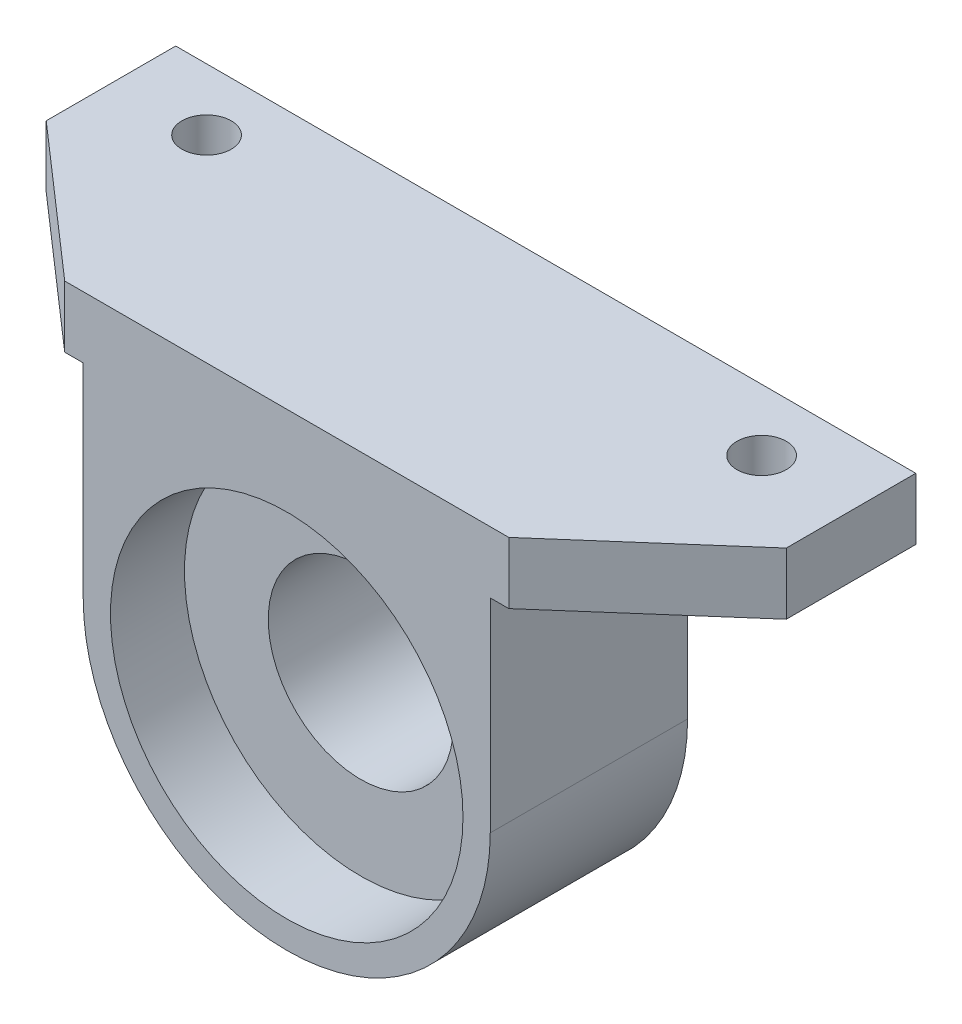
ISO-10303-21;
HEADER;
FILE_DESCRIPTION(('STEP AP214'),'2;1');
FILE_NAME('part.step','',(''),(''),'','','');
FILE_SCHEMA(('AUTOMOTIVE_DESIGN { 1 0 10303 214 1 1 1 1 }'));
ENDSEC;
DATA;
#1=APPLICATION_CONTEXT('core data for automotive mechanical design processes');
#2=APPLICATION_PROTOCOL_DEFINITION('international standard','automotive_design',2000,#1);
#3=PRODUCT_CONTEXT('',#1,'mechanical');
#4=PRODUCT('Part','Part','',(#3));
#5=PRODUCT_RELATED_PRODUCT_CATEGORY('part','',(#4));
#6=PRODUCT_DEFINITION_FORMATION('','',#4);
#7=PRODUCT_DEFINITION_CONTEXT('part definition',#1,'design');
#8=PRODUCT_DEFINITION('design','',#6,#7);
#9=PRODUCT_DEFINITION_SHAPE('','',#8);
#10=(LENGTH_UNIT() NAMED_UNIT(*) SI_UNIT(.MILLI.,.METRE.));
#11=(NAMED_UNIT(*) PLANE_ANGLE_UNIT() SI_UNIT($,.RADIAN.));
#12=(NAMED_UNIT(*) SI_UNIT($,.STERADIAN.) SOLID_ANGLE_UNIT());
#13=UNCERTAINTY_MEASURE_WITH_UNIT(LENGTH_MEASURE(1.E-05),#10,'distance_accuracy_value','');
#14=(GEOMETRIC_REPRESENTATION_CONTEXT(3) GLOBAL_UNCERTAINTY_ASSIGNED_CONTEXT((#13)) GLOBAL_UNIT_ASSIGNED_CONTEXT((#10,
#11,#12)) REPRESENTATION_CONTEXT('',''));
#15=CARTESIAN_POINT('',(0.,0.,0.));
#16=DIRECTION('',(0.,0.,1.));
#17=DIRECTION('',(1.,0.,0.));
#18=AXIS2_PLACEMENT_3D('',#15,#16,#17);
#19=CARTESIAN_POINT('',(0.,0.,6.));
#20=DIRECTION('',(0.,0.,1.));
#21=DIRECTION('',(1.,0.,0.));
#22=AXIS2_PLACEMENT_3D('',#19,#20,#21);
#23=PLANE('',#22);
#24=CARTESIAN_POINT('',(0.,0.,6.));
#25=DIRECTION('',(0.,0.,1.));
#26=DIRECTION('',(1.,0.,0.));
#27=AXIS2_PLACEMENT_3D('',#24,#25,#26);
#28=CIRCLE('',#27,14.29);
#29=CARTESIAN_POINT('',(14.29,0.,6.));
#30=VERTEX_POINT('',#29);
#31=EDGE_CURVE('E72',#30,#30,#28,.T.);
#32=ORIENTED_EDGE('',*,*,#31,.F.);
#33=EDGE_LOOP('',(#32));
#34=FACE_BOUND('',#33,.T.);
#35=DIRECTION('',(1.,0.,0.));
#36=VECTOR('',#35,1.);
#37=CARTESIAN_POINT('',(0.,16.5,6.));
#38=LINE('',#37,#36);
#39=CARTESIAN_POINT('',(16.5,16.5,6.));
#40=VERTEX_POINT('',#39);
#41=CARTESIAN_POINT('',(18.,16.5,6.));
#42=VERTEX_POINT('',#41);
#43=EDGE_CURVE('E153',#40,#42,#38,.T.);
#44=ORIENTED_EDGE('',*,*,#43,.T.);
#45=DIRECTION('',(0.,1.,0.));
#46=VECTOR('',#45,1.);
#47=CARTESIAN_POINT('',(18.,16.5,6.));
#48=LINE('',#47,#46);
#49=CARTESIAN_POINT('',(18.,21.5,6.));
#50=VERTEX_POINT('',#49);
#51=EDGE_CURVE('E138',#42,#50,#48,.T.);
#52=ORIENTED_EDGE('',*,*,#51,.T.);
#53=DIRECTION('',(1.,0.,0.));
#54=VECTOR('',#53,1.);
#55=CARTESIAN_POINT('',(-30.,21.5,6.));
#56=LINE('',#55,#54);
#57=CARTESIAN_POINT('',(-18.,21.5,6.00000000000001));
#58=VERTEX_POINT('',#57);
#59=EDGE_CURVE('E302',#58,#50,#56,.T.);
#60=ORIENTED_EDGE('',*,*,#59,.F.);
#61=DIRECTION('',(0.,1.,0.));
#62=VECTOR('',#61,1.);
#63=CARTESIAN_POINT('',(-18.,16.5,6.00000000000001));
#64=LINE('',#63,#62);
#65=CARTESIAN_POINT('',(-18.,16.5,6.00000000000001));
#66=VERTEX_POINT('',#65);
#67=EDGE_CURVE('E282',#66,#58,#64,.T.);
#68=ORIENTED_EDGE('',*,*,#67,.F.);
#69=CARTESIAN_POINT('',(-16.5,16.5,6.));
#70=VERTEX_POINT('',#69);
#71=EDGE_CURVE('E163',#66,#70,#38,.T.);
#72=ORIENTED_EDGE('',*,*,#71,.T.);
#73=DIRECTION('',(0.,-1.,0.));
#74=VECTOR('',#73,1.);
#75=CARTESIAN_POINT('',(-16.5,0.,6.));
#76=LINE('',#75,#74);
#77=CARTESIAN_POINT('',(-16.5,0.,6.));
#78=VERTEX_POINT('',#77);
#79=EDGE_CURVE('E199',#70,#78,#76,.T.);
#80=ORIENTED_EDGE('',*,*,#79,.T.);
#81=CARTESIAN_POINT('',(0.,0.,6.));
#82=DIRECTION('',(0.,0.,1.));
#83=DIRECTION('',(1.,0.,0.));
#84=AXIS2_PLACEMENT_3D('',#81,#82,#83);
#85=CIRCLE('',#84,16.5);
#86=CARTESIAN_POINT('',(16.5,0.,6.));
#87=VERTEX_POINT('',#86);
#88=EDGE_CURVE('E12',#78,#87,#85,.T.);
#89=ORIENTED_EDGE('',*,*,#88,.T.);
#90=DIRECTION('',(0.,-1.,0.));
#91=VECTOR('',#90,1.);
#92=CARTESIAN_POINT('',(16.5,0.,6.));
#93=LINE('',#92,#91);
#94=EDGE_CURVE('E161',#40,#87,#93,.T.);
#95=ORIENTED_EDGE('',*,*,#94,.F.);
#96=EDGE_LOOP('',(#44,#52,#60,#68,#72,#80,#89,#95));
#97=FACE_BOUND('',#96,.T.);
#98=ADVANCED_FACE('F63',(#34,#97),#23,.T.);
#99=CARTESIAN_POINT('',(0.,16.5,0.));
#100=DIRECTION('',(0.,1.,0.));
#101=DIRECTION('',(0.,0.,1.));
#102=AXIS2_PLACEMENT_3D('',#99,#100,#101);
#103=PLANE('',#102);
#104=CARTESIAN_POINT('',(22.5,16.5,-10.));
#105=DIRECTION('',(0.,1.,0.));
#106=DIRECTION('',(0.,0.,1.));
#107=AXIS2_PLACEMENT_3D('',#104,#105,#106);
#108=CIRCLE('',#107,2.);
#109=CARTESIAN_POINT('',(22.5,16.5,-7.99999999999999));
#110=VERTEX_POINT('',#109);
#111=EDGE_CURVE('E168',#110,#110,#108,.T.);
#112=ORIENTED_EDGE('',*,*,#111,.T.);
#113=EDGE_LOOP('',(#112));
#114=FACE_BOUND('',#113,.T.);
#115=CARTESIAN_POINT('',(-22.5,16.5,-10.));
#116=DIRECTION('',(0.,1.,0.));
#117=DIRECTION('',(0.,0.,1.));
#118=AXIS2_PLACEMENT_3D('',#115,#116,#117);
#119=CIRCLE('',#118,2.);
#120=CARTESIAN_POINT('',(-22.5,16.5,-7.99999999999999));
#121=VERTEX_POINT('',#120);
#122=EDGE_CURVE('E182',#121,#121,#119,.T.);
#123=ORIENTED_EDGE('',*,*,#122,.T.);
#124=EDGE_LOOP('',(#123));
#125=FACE_BOUND('',#124,.T.);
#126=DIRECTION('',(0.752576694706878,0.,-0.658504607868518));
#127=VECTOR('',#126,1.);
#128=CARTESIAN_POINT('',(10.7787610619469,16.5,12.3185840707965));
#129=LINE('',#128,#127);
#130=CARTESIAN_POINT('',(30.,16.5,-4.50000000000001));
#131=VERTEX_POINT('',#130);
#132=EDGE_CURVE('E87',#42,#131,#129,.T.);
#133=ORIENTED_EDGE('',*,*,#132,.F.);
#134=ORIENTED_EDGE('',*,*,#43,.F.);
#135=DIRECTION('',(0.,0.,-1.));
#136=VECTOR('',#135,1.);
#137=CARTESIAN_POINT('',(16.5,16.5,6.));
#138=LINE('',#137,#136);
#139=CARTESIAN_POINT('',(16.5,16.5,-10.));
#140=VERTEX_POINT('',#139);
#141=EDGE_CURVE('E189',#40,#140,#138,.T.);
#142=ORIENTED_EDGE('',*,*,#141,.T.);
#143=DIRECTION('',(-1.,0.,0.));
#144=VECTOR('',#143,1.);
#145=CARTESIAN_POINT('',(30.,16.5,-10.));
#146=LINE('',#145,#144);
#147=CARTESIAN_POINT('',(-16.5,16.5,-10.));
#148=VERTEX_POINT('',#147);
#149=EDGE_CURVE('E273',#140,#148,#146,.T.);
#150=ORIENTED_EDGE('',*,*,#149,.T.);
#151=DIRECTION('',(0.,0.,-1.));
#152=VECTOR('',#151,1.);
#153=CARTESIAN_POINT('',(-16.5,16.5,6.));
#154=LINE('',#153,#152);
#155=EDGE_CURVE('E209',#70,#148,#154,.T.);
#156=ORIENTED_EDGE('',*,*,#155,.F.);
#157=ORIENTED_EDGE('',*,*,#71,.F.);
#158=DIRECTION('',(0.752576694706878,0.,0.658504607868518));
#159=VECTOR('',#158,1.);
#160=CARTESIAN_POINT('',(-10.7787610619469,16.5,12.3185840707965));
#161=LINE('',#160,#159);
#162=CARTESIAN_POINT('',(-30.,16.5,-4.50000000000001));
#163=VERTEX_POINT('',#162);
#164=EDGE_CURVE('E322',#163,#66,#161,.T.);
#165=ORIENTED_EDGE('',*,*,#164,.F.);
#166=DIRECTION('',(0.,0.,-1.));
#167=VECTOR('',#166,1.);
#168=CARTESIAN_POINT('',(-30.,16.5,0.));
#169=LINE('',#168,#167);
#170=CARTESIAN_POINT('',(-30.,16.5,-15.));
#171=VERTEX_POINT('',#170);
#172=EDGE_CURVE('E179',#163,#171,#169,.T.);
#173=ORIENTED_EDGE('',*,*,#172,.T.);
#174=DIRECTION('',(-1.,0.,0.));
#175=VECTOR('',#174,1.);
#176=CARTESIAN_POINT('',(30.,16.5,-15.));
#177=LINE('',#176,#175);
#178=CARTESIAN_POINT('',(30.,16.5,-15.));
#179=VERTEX_POINT('',#178);
#180=EDGE_CURVE('E287',#179,#171,#177,.T.);
#181=ORIENTED_EDGE('',*,*,#180,.F.);
#182=DIRECTION('',(0.,0.,-1.));
#183=VECTOR('',#182,1.);
#184=CARTESIAN_POINT('',(30.,16.5,0.));
#185=LINE('',#184,#183);
#186=EDGE_CURVE('E156',#131,#179,#185,.T.);
#187=ORIENTED_EDGE('',*,*,#186,.F.);
#188=EDGE_LOOP('',(#133,#134,#142,#150,#156,#157,#165,#173,#181,#187));
#189=FACE_BOUND('',#188,.T.);
#190=ADVANCED_FACE('F151',(#114,#125,#189),#103,.F.);
#191=CARTESIAN_POINT('',(0.,21.5,0.));
#192=DIRECTION('',(0.,1.,0.));
#193=DIRECTION('',(0.,0.,1.));
#194=AXIS2_PLACEMENT_3D('',#191,#192,#193);
#195=PLANE('',#194);
#196=CARTESIAN_POINT('',(-22.5,21.5,-10.));
#197=DIRECTION('',(0.,1.,0.));
#198=DIRECTION('',(0.,0.,1.));
#199=AXIS2_PLACEMENT_3D('',#196,#197,#198);
#200=CIRCLE('',#199,2.);
#201=CARTESIAN_POINT('',(-22.5,21.5,-7.99999999999999));
#202=VERTEX_POINT('',#201);
#203=EDGE_CURVE('E170',#202,#202,#200,.T.);
#204=ORIENTED_EDGE('',*,*,#203,.F.);
#205=EDGE_LOOP('',(#204));
#206=FACE_BOUND('',#205,.T.);
#207=CARTESIAN_POINT('',(22.5,21.5,-10.));
#208=DIRECTION('',(0.,1.,0.));
#209=DIRECTION('',(0.,0.,1.));
#210=AXIS2_PLACEMENT_3D('',#207,#208,#209);
#211=CIRCLE('',#210,2.);
#212=CARTESIAN_POINT('',(22.5,21.5,-7.99999999999999));
#213=VERTEX_POINT('',#212);
#214=EDGE_CURVE('E164',#213,#213,#211,.T.);
#215=ORIENTED_EDGE('',*,*,#214,.F.);
#216=EDGE_LOOP('',(#215));
#217=FACE_BOUND('',#216,.T.);
#218=ORIENTED_EDGE('',*,*,#59,.T.);
#219=DIRECTION('',(0.752576694706878,0.,-0.658504607868518));
#220=VECTOR('',#219,1.);
#221=CARTESIAN_POINT('',(10.7787610619469,21.5,12.3185840707965));
#222=LINE('',#221,#220);
#223=CARTESIAN_POINT('',(30.,21.5,-4.50000000000001));
#224=VERTEX_POINT('',#223);
#225=EDGE_CURVE('E141',#50,#224,#222,.T.);
#226=ORIENTED_EDGE('',*,*,#225,.T.);
#227=DIRECTION('',(0.,0.,-1.));
#228=VECTOR('',#227,1.);
#229=CARTESIAN_POINT('',(30.,21.5,0.));
#230=LINE('',#229,#228);
#231=CARTESIAN_POINT('',(30.,21.5,-15.));
#232=VERTEX_POINT('',#231);
#233=EDGE_CURVE('E305',#224,#232,#230,.T.);
#234=ORIENTED_EDGE('',*,*,#233,.T.);
#235=DIRECTION('',(1.,0.,0.));
#236=VECTOR('',#235,1.);
#237=CARTESIAN_POINT('',(30.,21.5,-15.));
#238=LINE('',#237,#236);
#239=CARTESIAN_POINT('',(-30.,21.5,-15.));
#240=VERTEX_POINT('',#239);
#241=EDGE_CURVE('E293',#240,#232,#238,.T.);
#242=ORIENTED_EDGE('',*,*,#241,.F.);
#243=DIRECTION('',(0.,0.,-1.));
#244=VECTOR('',#243,1.);
#245=CARTESIAN_POINT('',(-30.,21.5,0.));
#246=LINE('',#245,#244);
#247=CARTESIAN_POINT('',(-30.,21.5,-4.50000000000001));
#248=VERTEX_POINT('',#247);
#249=EDGE_CURVE('E297',#248,#240,#246,.T.);
#250=ORIENTED_EDGE('',*,*,#249,.F.);
#251=DIRECTION('',(0.752576694706878,0.,0.658504607868518));
#252=VECTOR('',#251,1.);
#253=CARTESIAN_POINT('',(-10.7787610619469,21.5,12.3185840707965));
#254=LINE('',#253,#252);
#255=EDGE_CURVE('E79',#248,#58,#254,.T.);
#256=ORIENTED_EDGE('',*,*,#255,.T.);
#257=EDGE_LOOP('',(#218,#226,#234,#242,#250,#256));
#258=FACE_BOUND('',#257,.T.);
#259=ADVANCED_FACE('F242',(#206,#217,#258),#195,.T.);
#260=CARTESIAN_POINT('',(-30.,-16.5,0.));
#261=DIRECTION('',(1.,0.,0.));
#262=DIRECTION('',(0.,0.,-1.));
#263=AXIS2_PLACEMENT_3D('',#260,#261,#262);
#264=PLANE('',#263);
#265=DIRECTION('',(0.,1.,0.));
#266=VECTOR('',#265,1.);
#267=CARTESIAN_POINT('',(-30.,16.5,-4.50000000000001));
#268=LINE('',#267,#266);
#269=EDGE_CURVE('E289',#163,#248,#268,.T.);
#270=ORIENTED_EDGE('',*,*,#269,.T.);
#271=ORIENTED_EDGE('',*,*,#249,.T.);
#272=DIRECTION('',(0.,1.,0.));
#273=VECTOR('',#272,1.);
#274=CARTESIAN_POINT('',(-30.,21.5,-15.));
#275=LINE('',#274,#273);
#276=EDGE_CURVE('E330',#171,#240,#275,.T.);
#277=ORIENTED_EDGE('',*,*,#276,.F.);
#278=ORIENTED_EDGE('',*,*,#172,.F.);
#279=EDGE_LOOP('',(#270,#271,#277,#278));
#280=FACE_BOUND('',#279,.T.);
#281=ADVANCED_FACE('F249',(#280),#264,.F.);
#282=CARTESIAN_POINT('',(30.,-16.5,0.));
#283=DIRECTION('',(1.,0.,0.));
#284=DIRECTION('',(0.,0.,-1.));
#285=AXIS2_PLACEMENT_3D('',#282,#283,#284);
#286=PLANE('',#285);
#287=ORIENTED_EDGE('',*,*,#233,.F.);
#288=DIRECTION('',(0.,1.,0.));
#289=VECTOR('',#288,1.);
#290=CARTESIAN_POINT('',(30.,16.5,-4.50000000000001));
#291=LINE('',#290,#289);
#292=EDGE_CURVE('E147',#131,#224,#291,.T.);
#293=ORIENTED_EDGE('',*,*,#292,.F.);
#294=ORIENTED_EDGE('',*,*,#186,.T.);
#295=DIRECTION('',(0.,-1.,0.));
#296=VECTOR('',#295,1.);
#297=CARTESIAN_POINT('',(30.,21.5,-15.));
#298=LINE('',#297,#296);
#299=EDGE_CURVE('E281',#232,#179,#298,.T.);
#300=ORIENTED_EDGE('',*,*,#299,.F.);
#301=EDGE_LOOP('',(#287,#293,#294,#300));
#302=FACE_BOUND('',#301,.T.);
#303=ADVANCED_FACE('F260',(#302),#286,.T.);
#304=CARTESIAN_POINT('',(0.,0.,-10.));
#305=DIRECTION('',(0.,0.,-1.));
#306=DIRECTION('',(-1.,0.,0.));
#307=AXIS2_PLACEMENT_3D('',#304,#305,#306);
#308=PLANE('',#307);
#309=CARTESIAN_POINT('',(0.,0.,-10.));
#310=DIRECTION('',(0.,0.,1.));
#311=DIRECTION('',(1.,0.,0.));
#312=AXIS2_PLACEMENT_3D('',#309,#310,#311);
#313=CIRCLE('',#312,7.5);
#314=CARTESIAN_POINT('',(7.5,0.,-10.));
#315=VERTEX_POINT('',#314);
#316=EDGE_CURVE('E270',#315,#315,#313,.T.);
#317=ORIENTED_EDGE('',*,*,#316,.T.);
#318=EDGE_LOOP('',(#317));
#319=FACE_BOUND('',#318,.T.);
#320=DIRECTION('',(0.,-1.,0.));
#321=VECTOR('',#320,1.);
#322=CARTESIAN_POINT('',(-16.5,0.,-10.));
#323=LINE('',#322,#321);
#324=CARTESIAN_POINT('',(-16.5,0.,-10.));
#325=VERTEX_POINT('',#324);
#326=EDGE_CURVE('E198',#148,#325,#323,.T.);
#327=ORIENTED_EDGE('',*,*,#326,.F.);
#328=ORIENTED_EDGE('',*,*,#149,.F.);
#329=DIRECTION('',(0.,-1.,0.));
#330=VECTOR('',#329,1.);
#331=CARTESIAN_POINT('',(16.5,0.,-10.));
#332=LINE('',#331,#330);
#333=CARTESIAN_POINT('',(16.5,0.,-10.));
#334=VERTEX_POINT('',#333);
#335=EDGE_CURVE('E186',#140,#334,#332,.T.);
#336=ORIENTED_EDGE('',*,*,#335,.T.);
#337=CARTESIAN_POINT('',(0.,0.,-10.));
#338=DIRECTION('',(0.,0.,-1.));
#339=DIRECTION('',(-1.,0.,0.));
#340=AXIS2_PLACEMENT_3D('',#337,#338,#339);
#341=CIRCLE('',#340,16.5);
#342=EDGE_CURVE('E212',#334,#325,#341,.T.);
#343=ORIENTED_EDGE('',*,*,#342,.T.);
#344=EDGE_LOOP('',(#327,#328,#336,#343));
#345=FACE_BOUND('',#344,.T.);
#346=ADVANCED_FACE('F235',(#319,#345),#308,.T.);
#347=CARTESIAN_POINT('',(0.,0.,6.));
#348=DIRECTION('',(0.,0.,-1.));
#349=DIRECTION('',(-1.,0.,0.));
#350=AXIS2_PLACEMENT_3D('',#347,#348,#349);
#351=CYLINDRICAL_SURFACE('',#350,16.5);
#352=DIRECTION('',(0.,0.,-1.));
#353=VECTOR('',#352,1.);
#354=CARTESIAN_POINT('',(16.5,0.,6.));
#355=LINE('',#354,#353);
#356=EDGE_CURVE('E195',#87,#334,#355,.T.);
#357=ORIENTED_EDGE('',*,*,#356,.F.);
#358=ORIENTED_EDGE('',*,*,#88,.F.);
#359=DIRECTION('',(0.,0.,-1.));
#360=VECTOR('',#359,1.);
#361=CARTESIAN_POINT('',(-16.5,0.,6.));
#362=LINE('',#361,#360);
#363=EDGE_CURVE('E202',#78,#325,#362,.T.);
#364=ORIENTED_EDGE('',*,*,#363,.T.);
#365=ORIENTED_EDGE('',*,*,#342,.F.);
#366=EDGE_LOOP('',(#357,#358,#364,#365));
#367=FACE_BOUND('',#366,.T.);
#368=ADVANCED_FACE('F65',(#367),#351,.T.);
#369=CARTESIAN_POINT('',(0.,0.,6.));
#370=DIRECTION('',(0.,0.,-1.));
#371=DIRECTION('',(-1.,0.,0.));
#372=AXIS2_PLACEMENT_3D('',#369,#370,#371);
#373=CYLINDRICAL_SURFACE('',#372,14.29);
#374=ORIENTED_EDGE('',*,*,#31,.T.);
#375=EDGE_LOOP('',(#374));
#376=FACE_BOUND('',#375,.T.);
#377=CARTESIAN_POINT('',(0.,0.,0.));
#378=DIRECTION('',(0.,0.,1.));
#379=DIRECTION('',(1.,0.,0.));
#380=AXIS2_PLACEMENT_3D('',#377,#378,#379);
#381=CIRCLE('',#380,14.29);
#382=CARTESIAN_POINT('',(14.29,0.,0.));
#383=VERTEX_POINT('',#382);
#384=EDGE_CURVE('E215',#383,#383,#381,.T.);
#385=ORIENTED_EDGE('',*,*,#384,.F.);
#386=EDGE_LOOP('',(#385));
#387=FACE_BOUND('',#386,.T.);
#388=ADVANCED_FACE('F224',(#376,#387),#373,.F.);
#389=CARTESIAN_POINT('',(0.,0.,0.));
#390=DIRECTION('',(0.,0.,-1.));
#391=DIRECTION('',(-1.,0.,0.));
#392=AXIS2_PLACEMENT_3D('',#389,#390,#391);
#393=PLANE('',#392);
#394=CARTESIAN_POINT('',(0.,0.,0.));
#395=DIRECTION('',(0.,0.,1.));
#396=DIRECTION('',(1.,0.,0.));
#397=AXIS2_PLACEMENT_3D('',#394,#395,#396);
#398=CIRCLE('',#397,7.5);
#399=CARTESIAN_POINT('',(7.5,0.,0.));
#400=VERTEX_POINT('',#399);
#401=EDGE_CURVE('E298',#400,#400,#398,.T.);
#402=ORIENTED_EDGE('',*,*,#401,.F.);
#403=EDGE_LOOP('',(#402));
#404=FACE_BOUND('',#403,.T.);
#405=ORIENTED_EDGE('',*,*,#384,.T.);
#406=EDGE_LOOP('',(#405));
#407=FACE_BOUND('',#406,.T.);
#408=ADVANCED_FACE('F222',(#404,#407),#393,.F.);
#409=CARTESIAN_POINT('',(-16.5,0.,6.));
#410=DIRECTION('',(1.,0.,0.));
#411=DIRECTION('',(0.,1.,0.));
#412=AXIS2_PLACEMENT_3D('',#409,#410,#411);
#413=PLANE('',#412);
#414=ORIENTED_EDGE('',*,*,#326,.T.);
#415=ORIENTED_EDGE('',*,*,#363,.F.);
#416=ORIENTED_EDGE('',*,*,#79,.F.);
#417=ORIENTED_EDGE('',*,*,#155,.T.);
#418=EDGE_LOOP('',(#414,#415,#416,#417));
#419=FACE_BOUND('',#418,.T.);
#420=ADVANCED_FACE('F232',(#419),#413,.F.);
#421=CARTESIAN_POINT('',(16.5,0.,6.));
#422=DIRECTION('',(1.,0.,0.));
#423=DIRECTION('',(0.,1.,0.));
#424=AXIS2_PLACEMENT_3D('',#421,#422,#423);
#425=PLANE('',#424);
#426=ORIENTED_EDGE('',*,*,#335,.F.);
#427=ORIENTED_EDGE('',*,*,#141,.F.);
#428=ORIENTED_EDGE('',*,*,#94,.T.);
#429=ORIENTED_EDGE('',*,*,#356,.T.);
#430=EDGE_LOOP('',(#426,#427,#428,#429));
#431=FACE_BOUND('',#430,.T.);
#432=ADVANCED_FACE('F257',(#431),#425,.T.);
#433=CARTESIAN_POINT('',(22.5,-16.5,-10.));
#434=DIRECTION('',(0.,1.,0.));
#435=DIRECTION('',(0.,0.,1.));
#436=AXIS2_PLACEMENT_3D('',#433,#434,#435);
#437=CYLINDRICAL_SURFACE('',#436,2.);
#438=ORIENTED_EDGE('',*,*,#214,.T.);
#439=EDGE_LOOP('',(#438));
#440=FACE_BOUND('',#439,.T.);
#441=ORIENTED_EDGE('',*,*,#111,.F.);
#442=EDGE_LOOP('',(#441));
#443=FACE_BOUND('',#442,.T.);
#444=ADVANCED_FACE('F365',(#440,#443),#437,.F.);
#445=CARTESIAN_POINT('',(-22.5,-16.5,-10.));
#446=DIRECTION('',(0.,1.,0.));
#447=DIRECTION('',(0.,0.,1.));
#448=AXIS2_PLACEMENT_3D('',#445,#446,#447);
#449=CYLINDRICAL_SURFACE('',#448,2.);
#450=ORIENTED_EDGE('',*,*,#203,.T.);
#451=EDGE_LOOP('',(#450));
#452=FACE_BOUND('',#451,.T.);
#453=ORIENTED_EDGE('',*,*,#122,.F.);
#454=EDGE_LOOP('',(#453));
#455=FACE_BOUND('',#454,.T.);
#456=ADVANCED_FACE('F313',(#452,#455),#449,.F.);
#457=CARTESIAN_POINT('',(0.,0.,-10.));
#458=DIRECTION('',(0.,0.,1.));
#459=DIRECTION('',(1.,0.,0.));
#460=AXIS2_PLACEMENT_3D('',#457,#458,#459);
#461=CYLINDRICAL_SURFACE('',#460,7.5);
#462=ORIENTED_EDGE('',*,*,#316,.F.);
#463=EDGE_LOOP('',(#462));
#464=FACE_BOUND('',#463,.T.);
#465=ORIENTED_EDGE('',*,*,#401,.T.);
#466=EDGE_LOOP('',(#465));
#467=FACE_BOUND('',#466,.T.);
#468=ADVANCED_FACE('F349',(#464,#467),#461,.F.);
#469=CARTESIAN_POINT('',(0.,0.,-15.));
#470=DIRECTION('',(0.,0.,-1.));
#471=DIRECTION('',(-1.,0.,0.));
#472=AXIS2_PLACEMENT_3D('',#469,#470,#471);
#473=PLANE('',#472);
#474=ORIENTED_EDGE('',*,*,#299,.T.);
#475=ORIENTED_EDGE('',*,*,#180,.T.);
#476=ORIENTED_EDGE('',*,*,#276,.T.);
#477=ORIENTED_EDGE('',*,*,#241,.T.);
#478=EDGE_LOOP('',(#474,#475,#476,#477));
#479=FACE_BOUND('',#478,.T.);
#480=ADVANCED_FACE('F347',(#479),#473,.T.);
#481=CARTESIAN_POINT('',(10.7787610619469,16.5,12.3185840707965));
#482=DIRECTION('',(0.658504607868518,0.,0.752576694706878));
#483=DIRECTION('',(0.752576694706878,0.,-0.658504607868518));
#484=AXIS2_PLACEMENT_3D('',#481,#482,#483);
#485=PLANE('',#484);
#486=ORIENTED_EDGE('',*,*,#225,.F.);
#487=ORIENTED_EDGE('',*,*,#51,.F.);
#488=ORIENTED_EDGE('',*,*,#132,.T.);
#489=ORIENTED_EDGE('',*,*,#292,.T.);
#490=EDGE_LOOP('',(#486,#487,#488,#489));
#491=FACE_BOUND('',#490,.T.);
#492=ADVANCED_FACE('F139',(#491),#485,.T.);
#493=CARTESIAN_POINT('',(-10.7787610619469,16.5,12.3185840707965));
#494=DIRECTION('',(-0.658504607868518,0.,0.752576694706878));
#495=DIRECTION('',(0.752576694706878,0.,0.658504607868518));
#496=AXIS2_PLACEMENT_3D('',#493,#494,#495);
#497=PLANE('',#496);
#498=ORIENTED_EDGE('',*,*,#255,.F.);
#499=ORIENTED_EDGE('',*,*,#269,.F.);
#500=ORIENTED_EDGE('',*,*,#164,.T.);
#501=ORIENTED_EDGE('',*,*,#67,.T.);
#502=EDGE_LOOP('',(#498,#499,#500,#501));
#503=FACE_BOUND('',#502,.T.);
#504=ADVANCED_FACE('F355',(#503),#497,.T.);
#505=CLOSED_SHELL('',(#98,#190,#259,#281,#303,#346,#368,#388,#408,#420,#432,#444,#456,#468,#480,
#492,#504));
#506=MANIFOLD_SOLID_BREP('B2',#505);
#507=ADVANCED_BREP_SHAPE_REPRESENTATION('',(#18,#506),#14);
#508=SHAPE_DEFINITION_REPRESENTATION(#9,#507);
ENDSEC;
END-ISO-10303-21;
